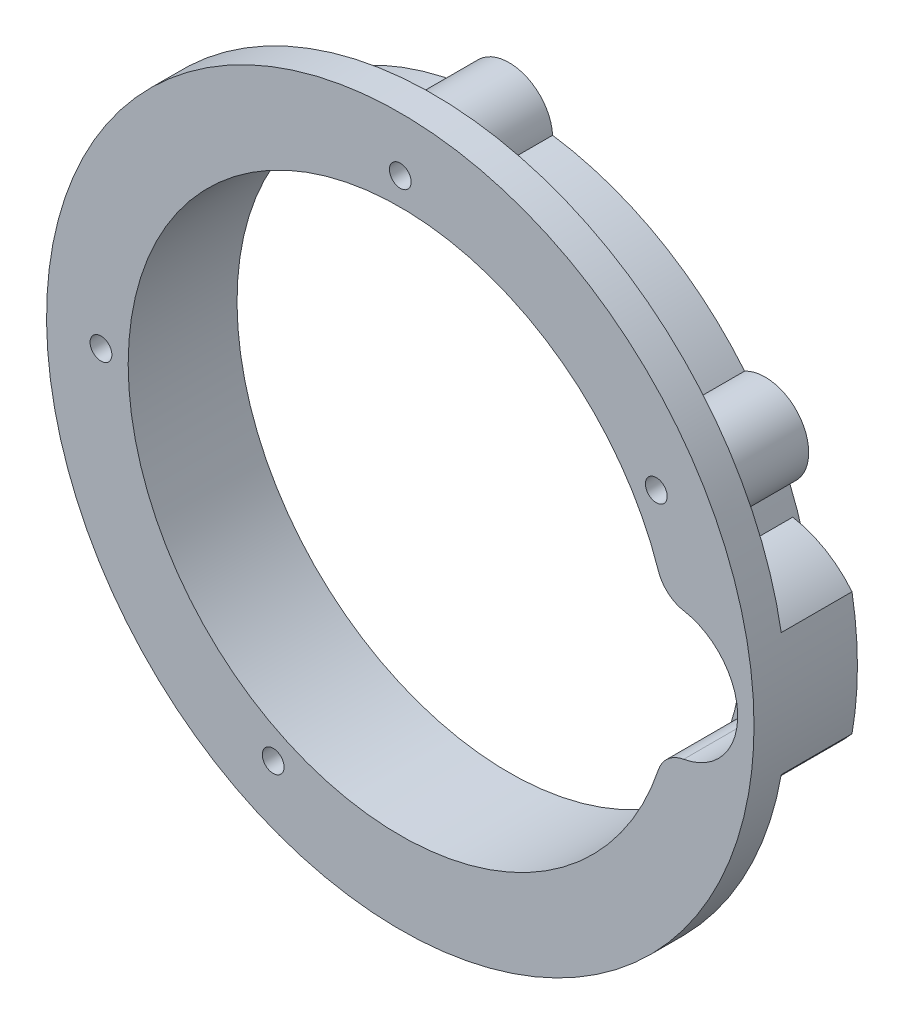
ISO-10303-21;
HEADER;
FILE_DESCRIPTION(('STEP AP214'),'2;1');
FILE_NAME('part.step','',(''),(''),'','','');
FILE_SCHEMA(('AUTOMOTIVE_DESIGN { 1 0 10303 214 1 1 1 1 }'));
ENDSEC;
DATA;
#1=APPLICATION_CONTEXT('core data for automotive mechanical design processes');
#2=APPLICATION_PROTOCOL_DEFINITION('international standard','automotive_design',2000,#1);
#3=PRODUCT_CONTEXT('',#1,'mechanical');
#4=PRODUCT('Part','Part','',(#3));
#5=PRODUCT_RELATED_PRODUCT_CATEGORY('part','',(#4));
#6=PRODUCT_DEFINITION_FORMATION('','',#4);
#7=PRODUCT_DEFINITION_CONTEXT('part definition',#1,'design');
#8=PRODUCT_DEFINITION('design','',#6,#7);
#9=PRODUCT_DEFINITION_SHAPE('','',#8);
#10=(LENGTH_UNIT() NAMED_UNIT(*) SI_UNIT(.MILLI.,.METRE.));
#11=(NAMED_UNIT(*) PLANE_ANGLE_UNIT() SI_UNIT($,.RADIAN.));
#12=(NAMED_UNIT(*) SI_UNIT($,.STERADIAN.) SOLID_ANGLE_UNIT());
#13=UNCERTAINTY_MEASURE_WITH_UNIT(LENGTH_MEASURE(1.E-05),#10,'distance_accuracy_value','');
#14=(GEOMETRIC_REPRESENTATION_CONTEXT(3) GLOBAL_UNCERTAINTY_ASSIGNED_CONTEXT((#13)) GLOBAL_UNIT_ASSIGNED_CONTEXT((#10,
#11,#12)) REPRESENTATION_CONTEXT('',''));
#15=CARTESIAN_POINT('',(0.,0.,0.));
#16=DIRECTION('',(0.,0.,1.));
#17=DIRECTION('',(1.,0.,0.));
#18=AXIS2_PLACEMENT_3D('',#15,#16,#17);
#19=CARTESIAN_POINT('',(0.,0.,0.));
#20=DIRECTION('',(0.,0.,1.));
#21=DIRECTION('',(1.,0.,0.));
#22=AXIS2_PLACEMENT_3D('',#19,#20,#21);
#23=PLANE('',#22);
#24=CARTESIAN_POINT('',(-11.6772727272727,-24.8976163849653,0.));
#25=DIRECTION('',(0.,0.,1.));
#26=DIRECTION('',(1.,0.,0.));
#27=AXIS2_PLACEMENT_3D('',#24,#25,#26);
#28=CIRCLE('',#27,1.);
#29=CARTESIAN_POINT('',(-10.6772727272727,-24.8976163849653,0.));
#30=VERTEX_POINT('',#29);
#31=EDGE_CURVE('E232',#30,#30,#28,.T.);
#32=ORIENTED_EDGE('',*,*,#31,.T.);
#33=EDGE_LOOP('',(#32));
#34=FACE_BOUND('',#33,.T.);
#35=CARTESIAN_POINT('',(-27.5,0.,0.));
#36=DIRECTION('',(0.,0.,1.));
#37=DIRECTION('',(1.,0.,0.));
#38=AXIS2_PLACEMENT_3D('',#35,#36,#37);
#39=CIRCLE('',#38,1.);
#40=CARTESIAN_POINT('',(-26.5,0.,0.));
#41=VERTEX_POINT('',#40);
#42=EDGE_CURVE('E238',#41,#41,#39,.T.);
#43=ORIENTED_EDGE('',*,*,#42,.T.);
#44=EDGE_LOOP('',(#43));
#45=FACE_BOUND('',#44,.T.);
#46=CARTESIAN_POINT('',(23.5226916995778,14.2454545454545,0.));
#47=DIRECTION('',(0.,0.,1.));
#48=DIRECTION('',(1.,0.,0.));
#49=AXIS2_PLACEMENT_3D('',#46,#47,#48);
#50=CIRCLE('',#49,1.);
#51=CARTESIAN_POINT('',(24.5226916995778,14.2454545454545,0.));
#52=VERTEX_POINT('',#51);
#53=EDGE_CURVE('E244',#52,#52,#50,.T.);
#54=ORIENTED_EDGE('',*,*,#53,.T.);
#55=EDGE_LOOP('',(#54));
#56=FACE_BOUND('',#55,.T.);
#57=CARTESIAN_POINT('',(0.,27.5,0.));
#58=DIRECTION('',(0.,0.,1.));
#59=DIRECTION('',(1.,0.,0.));
#60=AXIS2_PLACEMENT_3D('',#57,#58,#59);
#61=CIRCLE('',#60,1.);
#62=CARTESIAN_POINT('',(1.,27.5,0.));
#63=VERTEX_POINT('',#62);
#64=EDGE_CURVE('E250',#63,#63,#61,.T.);
#65=ORIENTED_EDGE('',*,*,#64,.T.);
#66=EDGE_LOOP('',(#65));
#67=FACE_BOUND('',#66,.T.);
#68=CARTESIAN_POINT('',(0.,0.,0.));
#69=DIRECTION('',(0.,0.,1.));
#70=DIRECTION('',(1.,0.,0.));
#71=AXIS2_PLACEMENT_3D('',#68,#69,#70);
#72=CIRCLE('',#71,25.);
#73=CARTESIAN_POINT('',(25.,0.,0.));
#74=VERTEX_POINT('',#73);
#75=EDGE_CURVE('E256',#74,#74,#72,.T.);
#76=ORIENTED_EDGE('',*,*,#75,.T.);
#77=EDGE_LOOP('',(#76));
#78=FACE_BOUND('',#77,.T.);
#79=CARTESIAN_POINT('',(0.,0.,0.));
#80=DIRECTION('',(0.,0.,1.));
#81=DIRECTION('',(1.,0.,0.));
#82=AXIS2_PLACEMENT_3D('',#79,#80,#81);
#83=CIRCLE('',#82,28.);
#84=CARTESIAN_POINT('',(-27.7136363636364,-3.99429086373692,0.));
#85=VERTEX_POINT('',#84);
#86=CARTESIAN_POINT('',(-15.384291335925,-23.3949477471394,0.));
#87=VERTEX_POINT('',#86);
#88=EDGE_CURVE('E189',#85,#87,#83,.T.);
#89=ORIENTED_EDGE('',*,*,#88,.F.);
#90=CARTESIAN_POINT('',(-27.5,0.,0.));
#91=DIRECTION('',(0.,0.,1.));
#92=DIRECTION('',(1.,0.,0.));
#93=AXIS2_PLACEMENT_3D('',#90,#91,#92);
#94=CIRCLE('',#93,4.);
#95=CARTESIAN_POINT('',(-27.7136363636364,3.99429086373692,0.));
#96=VERTEX_POINT('',#95);
#97=EDGE_CURVE('E200',#96,#85,#94,.T.);
#98=ORIENTED_EDGE('',*,*,#97,.F.);
#99=CARTESIAN_POINT('',(-3.99429086373693,27.7136363636364,0.));
#100=VERTEX_POINT('',#99);
#101=EDGE_CURVE('E51',#100,#96,#83,.T.);
#102=ORIENTED_EDGE('',*,*,#101,.F.);
#103=CARTESIAN_POINT('',(0.,27.5,0.));
#104=DIRECTION('',(0.,0.,1.));
#105=DIRECTION('',(1.,0.,0.));
#106=AXIS2_PLACEMENT_3D('',#103,#104,#105);
#107=CIRCLE('',#106,4.);
#108=CARTESIAN_POINT('',(3.99429086373693,27.7136363636364,0.));
#109=VERTEX_POINT('',#108);
#110=EDGE_CURVE('E191',#109,#100,#107,.T.);
#111=ORIENTED_EDGE('',*,*,#110,.F.);
#112=CARTESIAN_POINT('',(21.6363212769214,17.772720714675,0.));
#113=VERTEX_POINT('',#112);
#114=EDGE_CURVE('E190',#113,#109,#83,.T.);
#115=ORIENTED_EDGE('',*,*,#114,.F.);
#116=CARTESIAN_POINT('',(23.5226916995778,14.2454545454545,0.));
#117=DIRECTION('',(0.,0.,1.));
#118=DIRECTION('',(1.,0.,0.));
#119=AXIS2_PLACEMENT_3D('',#116,#117,#118);
#120=CIRCLE('',#119,4.);
#121=CARTESIAN_POINT('',(25.7745386544261,10.9395227113205,0.));
#122=VERTEX_POINT('',#121);
#123=EDGE_CURVE('E196',#122,#113,#120,.T.);
#124=ORIENTED_EDGE('',*,*,#123,.F.);
#125=CARTESIAN_POINT('',(-8.15168612463095,-26.7871240211692,0.));
#126=VERTEX_POINT('',#125);
#127=EDGE_CURVE('E187',#126,#122,#83,.T.);
#128=ORIENTED_EDGE('',*,*,#127,.F.);
#129=CARTESIAN_POINT('',(-11.6772727272727,-24.8976163849653,0.));
#130=DIRECTION('',(0.,0.,1.));
#131=DIRECTION('',(1.,0.,0.));
#132=AXIS2_PLACEMENT_3D('',#129,#130,#131);
#133=CIRCLE('',#132,4.);
#134=EDGE_CURVE('E184',#87,#126,#133,.T.);
#135=ORIENTED_EDGE('',*,*,#134,.F.);
#136=EDGE_LOOP('',(#89,#98,#102,#111,#115,#124,#128,#135));
#137=FACE_BOUND('',#136,.T.);
#138=ADVANCED_FACE('F36',(#34,#45,#56,#67,#78,#137),#23,.F.);
#139=CARTESIAN_POINT('',(0.,0.,10.));
#140=DIRECTION('',(0.,0.,1.));
#141=DIRECTION('',(1.,0.,0.));
#142=AXIS2_PLACEMENT_3D('',#139,#140,#141);
#143=PLANE('',#142);
#144=CARTESIAN_POINT('',(25.,0.,10.));
#145=DIRECTION('',(0.,0.,1.));
#146=DIRECTION('',(1.,0.,0.));
#147=AXIS2_PLACEMENT_3D('',#144,#145,#146);
#148=CIRCLE('',#147,6.);
#149=CARTESIAN_POINT('',(26.04,-5.90917930003821,10.));
#150=VERTEX_POINT('',#149);
#151=CARTESIAN_POINT('',(26.04,5.90917930003821,10.));
#152=VERTEX_POINT('',#151);
#153=EDGE_CURVE('E228',#150,#152,#148,.T.);
#154=ORIENTED_EDGE('',*,*,#153,.F.);
#155=CARTESIAN_POINT('',(26.56,-8.86376895005731,10.));
#156=DIRECTION('',(0.,0.,1.));
#157=DIRECTION('',(1.,0.,0.));
#158=AXIS2_PLACEMENT_3D('',#155,#156,#157);
#159=CIRCLE('',#158,3.);
#160=CARTESIAN_POINT('',(23.7142857142857,-7.91407941969402,10.));
#161=VERTEX_POINT('',#160);
#162=EDGE_CURVE('E277',#150,#161,#159,.T.);
#163=ORIENTED_EDGE('',*,*,#162,.T.);
#164=CARTESIAN_POINT('',(0.,0.,10.));
#165=DIRECTION('',(0.,0.,1.));
#166=DIRECTION('',(1.,0.,0.));
#167=AXIS2_PLACEMENT_3D('',#164,#165,#166);
#168=CIRCLE('',#167,25.);
#169=CARTESIAN_POINT('',(23.7142857142857,7.91407941969402,10.));
#170=VERTEX_POINT('',#169);
#171=EDGE_CURVE('E259',#170,#161,#168,.T.);
#172=ORIENTED_EDGE('',*,*,#171,.F.);
#173=CARTESIAN_POINT('',(26.56,8.86376895005731,10.));
#174=DIRECTION('',(0.,0.,1.));
#175=DIRECTION('',(1.,0.,0.));
#176=AXIS2_PLACEMENT_3D('',#173,#174,#175);
#177=CIRCLE('',#176,3.);
#178=EDGE_CURVE('E275',#170,#152,#177,.T.);
#179=ORIENTED_EDGE('',*,*,#178,.T.);
#180=EDGE_LOOP('',(#154,#163,#172,#179));
#181=FACE_BOUND('',#180,.T.);
#182=CARTESIAN_POINT('',(-27.5,0.,10.));
#183=DIRECTION('',(0.,0.,1.));
#184=DIRECTION('',(1.,0.,0.));
#185=AXIS2_PLACEMENT_3D('',#182,#183,#184);
#186=CIRCLE('',#185,1.);
#187=CARTESIAN_POINT('',(-26.5,0.,10.));
#188=VERTEX_POINT('',#187);
#189=EDGE_CURVE('E241',#188,#188,#186,.T.);
#190=ORIENTED_EDGE('',*,*,#189,.F.);
#191=EDGE_LOOP('',(#190));
#192=FACE_BOUND('',#191,.T.);
#193=CARTESIAN_POINT('',(0.,27.5,10.));
#194=DIRECTION('',(0.,0.,1.));
#195=DIRECTION('',(1.,0.,0.));
#196=AXIS2_PLACEMENT_3D('',#193,#194,#195);
#197=CIRCLE('',#196,1.);
#198=CARTESIAN_POINT('',(1.,27.5,10.));
#199=VERTEX_POINT('',#198);
#200=EDGE_CURVE('E253',#199,#199,#197,.T.);
#201=ORIENTED_EDGE('',*,*,#200,.F.);
#202=EDGE_LOOP('',(#201));
#203=FACE_BOUND('',#202,.T.);
#204=CARTESIAN_POINT('',(0.,0.,10.));
#205=DIRECTION('',(0.,0.,1.));
#206=DIRECTION('',(1.,0.,0.));
#207=AXIS2_PLACEMENT_3D('',#204,#205,#206);
#208=CIRCLE('',#207,32.5);
#209=CARTESIAN_POINT('',(32.5,0.,10.));
#210=VERTEX_POINT('',#209);
#211=EDGE_CURVE('E262',#210,#210,#208,.T.);
#212=ORIENTED_EDGE('',*,*,#211,.T.);
#213=EDGE_LOOP('',(#212));
#214=FACE_BOUND('',#213,.T.);
#215=CARTESIAN_POINT('',(23.5226916995778,14.2454545454545,10.));
#216=DIRECTION('',(0.,0.,1.));
#217=DIRECTION('',(1.,0.,0.));
#218=AXIS2_PLACEMENT_3D('',#215,#216,#217);
#219=CIRCLE('',#218,1.);
#220=CARTESIAN_POINT('',(24.5226916995778,14.2454545454545,10.));
#221=VERTEX_POINT('',#220);
#222=EDGE_CURVE('E247',#221,#221,#219,.T.);
#223=ORIENTED_EDGE('',*,*,#222,.F.);
#224=EDGE_LOOP('',(#223));
#225=FACE_BOUND('',#224,.T.);
#226=CARTESIAN_POINT('',(-11.6772727272727,-24.8976163849653,10.));
#227=DIRECTION('',(0.,0.,1.));
#228=DIRECTION('',(1.,0.,0.));
#229=AXIS2_PLACEMENT_3D('',#226,#227,#228);
#230=CIRCLE('',#229,1.);
#231=CARTESIAN_POINT('',(-10.6772727272727,-24.8976163849653,10.));
#232=VERTEX_POINT('',#231);
#233=EDGE_CURVE('E235',#232,#232,#230,.T.);
#234=ORIENTED_EDGE('',*,*,#233,.F.);
#235=EDGE_LOOP('',(#234));
#236=FACE_BOUND('',#235,.T.);
#237=ADVANCED_FACE('F297',(#181,#192,#203,#214,#225,#236),#143,.T.);
#238=CARTESIAN_POINT('',(0.,0.,10.));
#239=DIRECTION('',(0.,0.,-1.));
#240=DIRECTION('',(-1.,0.,0.));
#241=AXIS2_PLACEMENT_3D('',#238,#239,#240);
#242=CYLINDRICAL_SURFACE('',#241,32.5);
#243=DIRECTION('',(0.,0.,1.));
#244=VECTOR('',#243,1.);
#245=CARTESIAN_POINT('',(32.005,-5.6506614657047,10.));
#246=LINE('',#245,#244);
#247=CARTESIAN_POINT('',(32.005,-5.65066146570468,7.));
#248=VERTEX_POINT('',#247);
#249=CARTESIAN_POINT('',(32.005,-5.6506614657047,0.5));
#250=VERTEX_POINT('',#249);
#251=EDGE_CURVE('E222',#248,#250,#246,.F.);
#252=ORIENTED_EDGE('',*,*,#251,.T.);
#253=CARTESIAN_POINT('',(0.,0.,0.5));
#254=DIRECTION('',(0.,0.,1.));
#255=DIRECTION('',(1.,0.,0.));
#256=AXIS2_PLACEMENT_3D('',#253,#254,#255);
#257=CIRCLE('',#256,32.5);
#258=CARTESIAN_POINT('',(32.005,5.65066146570468,0.5));
#259=VERTEX_POINT('',#258);
#260=EDGE_CURVE('E225',#250,#259,#257,.T.);
#261=ORIENTED_EDGE('',*,*,#260,.T.);
#262=DIRECTION('',(0.,0.,1.));
#263=VECTOR('',#262,1.);
#264=CARTESIAN_POINT('',(32.005,5.65066146570468,3.5));
#265=LINE('',#264,#263);
#266=CARTESIAN_POINT('',(32.005,5.65066146570468,7.));
#267=VERTEX_POINT('',#266);
#268=EDGE_CURVE('E220',#267,#259,#265,.F.);
#269=ORIENTED_EDGE('',*,*,#268,.F.);
#270=CARTESIAN_POINT('',(0.,0.,7.));
#271=DIRECTION('',(0.,0.,1.));
#272=DIRECTION('',(1.,0.,0.));
#273=AXIS2_PLACEMENT_3D('',#270,#271,#272);
#274=CIRCLE('',#273,32.5);
#275=EDGE_CURVE('E165',#267,#248,#274,.T.);
#276=ORIENTED_EDGE('',*,*,#275,.T.);
#277=EDGE_LOOP('',(#252,#261,#269,#276));
#278=FACE_BOUND('',#277,.T.);
#279=ORIENTED_EDGE('',*,*,#211,.F.);
#280=EDGE_LOOP('',(#279));
#281=FACE_BOUND('',#280,.T.);
#282=ADVANCED_FACE('F320',(#278,#281),#242,.T.);
#283=CARTESIAN_POINT('',(0.,0.,10.));
#284=DIRECTION('',(0.,0.,-1.));
#285=DIRECTION('',(-1.,0.,0.));
#286=AXIS2_PLACEMENT_3D('',#283,#284,#285);
#287=CYLINDRICAL_SURFACE('',#286,25.);
#288=ORIENTED_EDGE('',*,*,#171,.T.);
#289=DIRECTION('',(0.,0.,-1.));
#290=VECTOR('',#289,1.);
#291=CARTESIAN_POINT('',(23.7142857142857,-7.91407941969403,10.));
#292=LINE('',#291,#290);
#293=CARTESIAN_POINT('',(23.7142857142857,-7.91407941969402,3.5));
#294=VERTEX_POINT('',#293);
#295=EDGE_CURVE('E281',#161,#294,#292,.T.);
#296=ORIENTED_EDGE('',*,*,#295,.T.);
#297=CARTESIAN_POINT('',(0.,0.,3.5));
#298=DIRECTION('',(0.,0.,1.));
#299=DIRECTION('',(1.,0.,0.));
#300=AXIS2_PLACEMENT_3D('',#297,#298,#299);
#301=CIRCLE('',#300,25.);
#302=CARTESIAN_POINT('',(23.7142857142857,7.91407941969402,3.5));
#303=VERTEX_POINT('',#302);
#304=EDGE_CURVE('E267',#294,#303,#301,.T.);
#305=ORIENTED_EDGE('',*,*,#304,.T.);
#306=DIRECTION('',(0.,0.,-1.));
#307=VECTOR('',#306,1.);
#308=CARTESIAN_POINT('',(23.7142857142857,7.91407941969403,10.));
#309=LINE('',#308,#307);
#310=EDGE_CURVE('E279',#303,#170,#309,.F.);
#311=ORIENTED_EDGE('',*,*,#310,.T.);
#312=EDGE_LOOP('',(#288,#296,#305,#311));
#313=FACE_BOUND('',#312,.T.);
#314=ORIENTED_EDGE('',*,*,#75,.F.);
#315=EDGE_LOOP('',(#314));
#316=FACE_BOUND('',#315,.T.);
#317=ADVANCED_FACE('F301',(#313,#316),#287,.F.);
#318=CARTESIAN_POINT('',(0.,27.5,10.));
#319=DIRECTION('',(0.,0.,-1.));
#320=DIRECTION('',(-1.,0.,0.));
#321=AXIS2_PLACEMENT_3D('',#318,#319,#320);
#322=CYLINDRICAL_SURFACE('',#321,1.);
#323=ORIENTED_EDGE('',*,*,#200,.T.);
#324=EDGE_LOOP('',(#323));
#325=FACE_BOUND('',#324,.T.);
#326=ORIENTED_EDGE('',*,*,#64,.F.);
#327=EDGE_LOOP('',(#326));
#328=FACE_BOUND('',#327,.T.);
#329=ADVANCED_FACE('F330',(#325,#328),#322,.F.);
#330=CARTESIAN_POINT('',(23.5226916995778,14.2454545454545,10.));
#331=DIRECTION('',(0.,0.,-1.));
#332=DIRECTION('',(-1.,0.,0.));
#333=AXIS2_PLACEMENT_3D('',#330,#331,#332);
#334=CYLINDRICAL_SURFACE('',#333,1.);
#335=ORIENTED_EDGE('',*,*,#222,.T.);
#336=EDGE_LOOP('',(#335));
#337=FACE_BOUND('',#336,.T.);
#338=ORIENTED_EDGE('',*,*,#53,.F.);
#339=EDGE_LOOP('',(#338));
#340=FACE_BOUND('',#339,.T.);
#341=ADVANCED_FACE('F350',(#337,#340),#334,.F.);
#342=CARTESIAN_POINT('',(-27.5,0.,10.));
#343=DIRECTION('',(0.,0.,-1.));
#344=DIRECTION('',(-1.,0.,0.));
#345=AXIS2_PLACEMENT_3D('',#342,#343,#344);
#346=CYLINDRICAL_SURFACE('',#345,1.);
#347=ORIENTED_EDGE('',*,*,#189,.T.);
#348=EDGE_LOOP('',(#347));
#349=FACE_BOUND('',#348,.T.);
#350=ORIENTED_EDGE('',*,*,#42,.F.);
#351=EDGE_LOOP('',(#350));
#352=FACE_BOUND('',#351,.T.);
#353=ADVANCED_FACE('F342',(#349,#352),#346,.F.);
#354=CARTESIAN_POINT('',(-11.6772727272727,-24.8976163849653,10.));
#355=DIRECTION('',(0.,0.,-1.));
#356=DIRECTION('',(-1.,0.,0.));
#357=AXIS2_PLACEMENT_3D('',#354,#355,#356);
#358=CYLINDRICAL_SURFACE('',#357,1.);
#359=ORIENTED_EDGE('',*,*,#233,.T.);
#360=EDGE_LOOP('',(#359));
#361=FACE_BOUND('',#360,.T.);
#362=ORIENTED_EDGE('',*,*,#31,.F.);
#363=EDGE_LOOP('',(#362));
#364=FACE_BOUND('',#363,.T.);
#365=ADVANCED_FACE('F339',(#361,#364),#358,.F.);
#366=CARTESIAN_POINT('',(25.,0.,3.5));
#367=DIRECTION('',(0.,0.,1.));
#368=DIRECTION('',(1.,0.,0.));
#369=AXIS2_PLACEMENT_3D('',#366,#367,#368);
#370=CYLINDRICAL_SURFACE('',#369,6.);
#371=CARTESIAN_POINT('',(25.,0.,3.5));
#372=DIRECTION('',(0.,0.,1.));
#373=DIRECTION('',(1.,0.,0.));
#374=AXIS2_PLACEMENT_3D('',#371,#372,#373);
#375=CIRCLE('',#374,6.);
#376=CARTESIAN_POINT('',(26.04,-5.90917930003821,3.5));
#377=VERTEX_POINT('',#376);
#378=CARTESIAN_POINT('',(26.04,5.90917930003821,3.5));
#379=VERTEX_POINT('',#378);
#380=EDGE_CURVE('E229',#377,#379,#375,.T.);
#381=ORIENTED_EDGE('',*,*,#380,.F.);
#382=DIRECTION('',(0.,0.,1.));
#383=VECTOR('',#382,1.);
#384=CARTESIAN_POINT('',(26.04,-5.90917930003821,3.5));
#385=LINE('',#384,#383);
#386=EDGE_CURVE('E272',#377,#150,#385,.T.);
#387=ORIENTED_EDGE('',*,*,#386,.T.);
#388=ORIENTED_EDGE('',*,*,#153,.T.);
#389=DIRECTION('',(0.,0.,1.));
#390=VECTOR('',#389,1.);
#391=CARTESIAN_POINT('',(26.04,5.90917930003821,3.5));
#392=LINE('',#391,#390);
#393=EDGE_CURVE('E269',#152,#379,#392,.F.);
#394=ORIENTED_EDGE('',*,*,#393,.T.);
#395=EDGE_LOOP('',(#381,#387,#388,#394));
#396=FACE_BOUND('',#395,.T.);
#397=ADVANCED_FACE('F291',(#396),#370,.F.);
#398=CARTESIAN_POINT('',(25.,0.,3.5));
#399=DIRECTION('',(0.,0.,1.));
#400=DIRECTION('',(1.,0.,0.));
#401=AXIS2_PLACEMENT_3D('',#398,#399,#400);
#402=PLANE('',#401);
#403=ORIENTED_EDGE('',*,*,#304,.F.);
#404=CARTESIAN_POINT('',(26.56,-8.86376895005731,3.5));
#405=DIRECTION('',(0.,0.,1.));
#406=DIRECTION('',(1.,0.,0.));
#407=AXIS2_PLACEMENT_3D('',#404,#405,#406);
#408=CIRCLE('',#407,3.);
#409=EDGE_CURVE('E44',#294,#377,#408,.F.);
#410=ORIENTED_EDGE('',*,*,#409,.T.);
#411=ORIENTED_EDGE('',*,*,#380,.T.);
#412=CARTESIAN_POINT('',(26.56,8.86376895005731,3.5));
#413=DIRECTION('',(0.,0.,1.));
#414=DIRECTION('',(1.,0.,0.));
#415=AXIS2_PLACEMENT_3D('',#412,#413,#414);
#416=CIRCLE('',#415,3.);
#417=EDGE_CURVE('E11',#379,#303,#416,.F.);
#418=ORIENTED_EDGE('',*,*,#417,.T.);
#419=EDGE_LOOP('',(#403,#410,#411,#418));
#420=FACE_BOUND('',#419,.T.);
#421=ADVANCED_FACE('F286',(#420),#402,.T.);
#422=CARTESIAN_POINT('',(26.56,-8.86376895005731,10.));
#423=DIRECTION('',(0.,0.,1.));
#424=DIRECTION('',(1.,0.,0.));
#425=AXIS2_PLACEMENT_3D('',#422,#423,#424);
#426=CYLINDRICAL_SURFACE('',#425,3.);
#427=ORIENTED_EDGE('',*,*,#409,.F.);
#428=ORIENTED_EDGE('',*,*,#295,.F.);
#429=ORIENTED_EDGE('',*,*,#162,.F.);
#430=ORIENTED_EDGE('',*,*,#386,.F.);
#431=EDGE_LOOP('',(#427,#428,#429,#430));
#432=FACE_BOUND('',#431,.T.);
#433=ADVANCED_FACE('F294',(#432),#426,.T.);
#434=CARTESIAN_POINT('',(26.56,8.86376895005731,10.));
#435=DIRECTION('',(0.,0.,-1.));
#436=DIRECTION('',(-1.,0.,0.));
#437=AXIS2_PLACEMENT_3D('',#434,#435,#436);
#438=CYLINDRICAL_SURFACE('',#437,3.);
#439=ORIENTED_EDGE('',*,*,#178,.F.);
#440=ORIENTED_EDGE('',*,*,#310,.F.);
#441=ORIENTED_EDGE('',*,*,#417,.F.);
#442=ORIENTED_EDGE('',*,*,#393,.F.);
#443=EDGE_LOOP('',(#439,#440,#441,#442));
#444=FACE_BOUND('',#443,.T.);
#445=ADVANCED_FACE('F38',(#444),#438,.T.);
#446=CARTESIAN_POINT('',(25.,0.,3.5));
#447=DIRECTION('',(0.,0.,1.));
#448=DIRECTION('',(1.,0.,0.));
#449=AXIS2_PLACEMENT_3D('',#446,#447,#448);
#450=CYLINDRICAL_SURFACE('',#449,9.);
#451=CARTESIAN_POINT('',(25.,0.,7.));
#452=DIRECTION('',(0.,0.,1.));
#453=DIRECTION('',(1.,0.,0.));
#454=AXIS2_PLACEMENT_3D('',#451,#452,#453);
#455=CIRCLE('',#454,9.);
#456=CARTESIAN_POINT('',(26.56,-8.86376895005731,7.));
#457=VERTEX_POINT('',#456);
#458=EDGE_CURVE('E168',#457,#248,#455,.T.);
#459=ORIENTED_EDGE('',*,*,#458,.F.);
#460=DIRECTION('',(0.,0.,-1.));
#461=VECTOR('',#460,1.);
#462=CARTESIAN_POINT('',(26.56,-8.86376895005731,7.));
#463=LINE('',#462,#461);
#464=CARTESIAN_POINT('',(26.56,-8.86376895005731,0.5));
#465=VERTEX_POINT('',#464);
#466=EDGE_CURVE('E173',#457,#465,#463,.T.);
#467=ORIENTED_EDGE('',*,*,#466,.T.);
#468=CARTESIAN_POINT('',(25.,0.,0.5));
#469=DIRECTION('',(0.,0.,1.));
#470=DIRECTION('',(1.,0.,0.));
#471=AXIS2_PLACEMENT_3D('',#468,#469,#470);
#472=CIRCLE('',#471,9.);
#473=EDGE_CURVE('E181',#465,#250,#472,.T.);
#474=ORIENTED_EDGE('',*,*,#473,.T.);
#475=ORIENTED_EDGE('',*,*,#251,.F.);
#476=EDGE_LOOP('',(#459,#467,#474,#475));
#477=FACE_BOUND('',#476,.T.);
#478=ADVANCED_FACE('F306',(#477),#450,.T.);
#479=CARTESIAN_POINT('',(0.,0.,10.));
#480=DIRECTION('',(0.,0.,-1.));
#481=DIRECTION('',(-1.,0.,0.));
#482=AXIS2_PLACEMENT_3D('',#479,#480,#481);
#483=CYLINDRICAL_SURFACE('',#482,28.);
#484=DIRECTION('',(0.,0.,1.));
#485=VECTOR('',#484,1.);
#486=CARTESIAN_POINT('',(3.99429086373692,27.7136363636364,10.));
#487=LINE('',#486,#485);
#488=CARTESIAN_POINT('',(3.99429086373692,27.7136363636364,7.));
#489=VERTEX_POINT('',#488);
#490=EDGE_CURVE('E218',#109,#489,#487,.T.);
#491=ORIENTED_EDGE('',*,*,#490,.T.);
#492=CARTESIAN_POINT('',(0.,0.,7.));
#493=DIRECTION('',(0.,0.,1.));
#494=DIRECTION('',(1.,0.,0.));
#495=AXIS2_PLACEMENT_3D('',#492,#493,#494);
#496=CIRCLE('',#495,28.);
#497=CARTESIAN_POINT('',(21.6363212769214,17.772720714675,7.));
#498=VERTEX_POINT('',#497);
#499=EDGE_CURVE('E159',#498,#489,#496,.T.);
#500=ORIENTED_EDGE('',*,*,#499,.F.);
#501=DIRECTION('',(0.,0.,1.));
#502=VECTOR('',#501,1.);
#503=CARTESIAN_POINT('',(21.6363212769214,17.772720714675,10.));
#504=LINE('',#503,#502);
#505=EDGE_CURVE('E214',#113,#498,#504,.T.);
#506=ORIENTED_EDGE('',*,*,#505,.F.);
#507=ORIENTED_EDGE('',*,*,#114,.T.);
#508=EDGE_LOOP('',(#491,#500,#506,#507));
#509=FACE_BOUND('',#508,.T.);
#510=ADVANCED_FACE('F311',(#509),#483,.T.);
#511=ORIENTED_EDGE('',*,*,#101,.T.);
#512=DIRECTION('',(0.,0.,1.));
#513=VECTOR('',#512,1.);
#514=CARTESIAN_POINT('',(-27.7136363636364,3.99429086373692,10.));
#515=LINE('',#514,#513);
#516=CARTESIAN_POINT('',(-27.7136363636364,3.99429086373693,7.));
#517=VERTEX_POINT('',#516);
#518=EDGE_CURVE('E209',#96,#517,#515,.T.);
#519=ORIENTED_EDGE('',*,*,#518,.T.);
#520=CARTESIAN_POINT('',(-3.99429086373692,27.7136363636364,7.));
#521=VERTEX_POINT('',#520);
#522=EDGE_CURVE('E397',#521,#517,#496,.T.);
#523=ORIENTED_EDGE('',*,*,#522,.F.);
#524=DIRECTION('',(0.,0.,1.));
#525=VECTOR('',#524,1.);
#526=CARTESIAN_POINT('',(-3.99429086373693,27.7136363636364,10.));
#527=LINE('',#526,#525);
#528=EDGE_CURVE('E216',#100,#521,#527,.T.);
#529=ORIENTED_EDGE('',*,*,#528,.F.);
#530=EDGE_LOOP('',(#511,#519,#523,#529));
#531=FACE_BOUND('',#530,.T.);
#532=ADVANCED_FACE('F401',(#531),#483,.T.);
#533=ORIENTED_EDGE('',*,*,#88,.T.);
#534=DIRECTION('',(0.,0.,1.));
#535=VECTOR('',#534,1.);
#536=CARTESIAN_POINT('',(-15.384291335925,-23.3949477471394,10.));
#537=LINE('',#536,#535);
#538=CARTESIAN_POINT('',(-15.384291335925,-23.3949477471394,7.));
#539=VERTEX_POINT('',#538);
#540=EDGE_CURVE('E177',#87,#539,#537,.T.);
#541=ORIENTED_EDGE('',*,*,#540,.T.);
#542=CARTESIAN_POINT('',(-27.7136363636364,-3.99429086373693,7.));
#543=VERTEX_POINT('',#542);
#544=EDGE_CURVE('E161',#543,#539,#496,.T.);
#545=ORIENTED_EDGE('',*,*,#544,.F.);
#546=DIRECTION('',(0.,0.,1.));
#547=VECTOR('',#546,1.);
#548=CARTESIAN_POINT('',(-27.7136363636364,-3.99429086373693,10.));
#549=LINE('',#548,#547);
#550=EDGE_CURVE('E211',#85,#543,#549,.T.);
#551=ORIENTED_EDGE('',*,*,#550,.F.);
#552=EDGE_LOOP('',(#533,#541,#545,#551));
#553=FACE_BOUND('',#552,.T.);
#554=ADVANCED_FACE('F405',(#553),#483,.T.);
#555=CARTESIAN_POINT('',(0.,0.,7.));
#556=DIRECTION('',(0.,0.,1.));
#557=DIRECTION('',(1.,0.,0.));
#558=AXIS2_PLACEMENT_3D('',#555,#556,#557);
#559=PLANE('',#558);
#560=CARTESIAN_POINT('',(26.56,8.86376895005731,7.));
#561=VERTEX_POINT('',#560);
#562=EDGE_CURVE('E59',#267,#561,#455,.T.);
#563=ORIENTED_EDGE('',*,*,#562,.T.);
#564=CARTESIAN_POINT('',(25.7745386544261,10.9395227113205,7.));
#565=VERTEX_POINT('',#564);
#566=EDGE_CURVE('E150',#561,#565,#496,.T.);
#567=ORIENTED_EDGE('',*,*,#566,.T.);
#568=CARTESIAN_POINT('',(23.5226916995778,14.2454545454545,7.));
#569=DIRECTION('',(0.,0.,1.));
#570=DIRECTION('',(1.,0.,0.));
#571=AXIS2_PLACEMENT_3D('',#568,#569,#570);
#572=CIRCLE('',#571,4.);
#573=EDGE_CURVE('E195',#565,#498,#572,.T.);
#574=ORIENTED_EDGE('',*,*,#573,.T.);
#575=ORIENTED_EDGE('',*,*,#499,.T.);
#576=CARTESIAN_POINT('',(0.,27.5,7.));
#577=DIRECTION('',(0.,0.,1.));
#578=DIRECTION('',(1.,0.,0.));
#579=AXIS2_PLACEMENT_3D('',#576,#577,#578);
#580=CIRCLE('',#579,4.);
#581=EDGE_CURVE('E194',#489,#521,#580,.T.);
#582=ORIENTED_EDGE('',*,*,#581,.T.);
#583=ORIENTED_EDGE('',*,*,#522,.T.);
#584=CARTESIAN_POINT('',(-27.5,0.,7.));
#585=DIRECTION('',(0.,0.,1.));
#586=DIRECTION('',(1.,0.,0.));
#587=AXIS2_PLACEMENT_3D('',#584,#585,#586);
#588=CIRCLE('',#587,4.);
#589=EDGE_CURVE('E199',#517,#543,#588,.T.);
#590=ORIENTED_EDGE('',*,*,#589,.T.);
#591=ORIENTED_EDGE('',*,*,#544,.T.);
#592=CARTESIAN_POINT('',(-11.6772727272727,-24.8976163849653,7.));
#593=DIRECTION('',(0.,0.,1.));
#594=DIRECTION('',(1.,0.,0.));
#595=AXIS2_PLACEMENT_3D('',#592,#593,#594);
#596=CIRCLE('',#595,4.);
#597=CARTESIAN_POINT('',(-8.15168612463095,-26.7871240211692,7.));
#598=VERTEX_POINT('',#597);
#599=EDGE_CURVE('E203',#539,#598,#596,.T.);
#600=ORIENTED_EDGE('',*,*,#599,.T.);
#601=EDGE_CURVE('E186',#598,#457,#496,.T.);
#602=ORIENTED_EDGE('',*,*,#601,.T.);
#603=ORIENTED_EDGE('',*,*,#458,.T.);
#604=ORIENTED_EDGE('',*,*,#275,.F.);
#605=EDGE_LOOP('',(#563,#567,#574,#575,#582,#583,#590,#591,#600,#602,#603,#604));
#606=FACE_BOUND('',#605,.T.);
#607=ADVANCED_FACE('F162',(#606),#559,.F.);
#608=DIRECTION('',(0.,0.,1.));
#609=VECTOR('',#608,1.);
#610=CARTESIAN_POINT('',(25.7745386544261,10.9395227113205,10.));
#611=LINE('',#610,#609);
#612=EDGE_CURVE('E155',#122,#565,#611,.T.);
#613=ORIENTED_EDGE('',*,*,#612,.T.);
#614=ORIENTED_EDGE('',*,*,#566,.F.);
#615=DIRECTION('',(0.,0.,-1.));
#616=VECTOR('',#615,1.);
#617=CARTESIAN_POINT('',(26.56,8.86376895005731,0.5));
#618=LINE('',#617,#616);
#619=CARTESIAN_POINT('',(26.56,8.86376895005731,0.5));
#620=VERTEX_POINT('',#619);
#621=EDGE_CURVE('E153',#620,#561,#618,.F.);
#622=ORIENTED_EDGE('',*,*,#621,.F.);
#623=CARTESIAN_POINT('',(0.,0.,0.5));
#624=DIRECTION('',(0.,0.,1.));
#625=DIRECTION('',(1.,0.,0.));
#626=AXIS2_PLACEMENT_3D('',#623,#624,#625);
#627=CIRCLE('',#626,28.);
#628=EDGE_CURVE('E174',#465,#620,#627,.T.);
#629=ORIENTED_EDGE('',*,*,#628,.F.);
#630=ORIENTED_EDGE('',*,*,#466,.F.);
#631=ORIENTED_EDGE('',*,*,#601,.F.);
#632=DIRECTION('',(0.,0.,1.));
#633=VECTOR('',#632,1.);
#634=CARTESIAN_POINT('',(-8.15168612463095,-26.7871240211692,10.));
#635=LINE('',#634,#633);
#636=EDGE_CURVE('E207',#126,#598,#635,.T.);
#637=ORIENTED_EDGE('',*,*,#636,.F.);
#638=ORIENTED_EDGE('',*,*,#127,.T.);
#639=EDGE_LOOP('',(#613,#614,#622,#629,#630,#631,#637,#638));
#640=FACE_BOUND('',#639,.T.);
#641=ADVANCED_FACE('F151',(#640),#483,.T.);
#642=CARTESIAN_POINT('',(0.,27.5,10.));
#643=DIRECTION('',(0.,0.,-1.));
#644=DIRECTION('',(-1.,0.,0.));
#645=AXIS2_PLACEMENT_3D('',#642,#643,#644);
#646=CYLINDRICAL_SURFACE('',#645,4.);
#647=ORIENTED_EDGE('',*,*,#110,.T.);
#648=ORIENTED_EDGE('',*,*,#528,.T.);
#649=ORIENTED_EDGE('',*,*,#581,.F.);
#650=ORIENTED_EDGE('',*,*,#490,.F.);
#651=EDGE_LOOP('',(#647,#648,#649,#650));
#652=FACE_BOUND('',#651,.T.);
#653=ADVANCED_FACE('F400',(#652),#646,.T.);
#654=CARTESIAN_POINT('',(23.5226916995778,14.2454545454545,10.));
#655=DIRECTION('',(0.,0.,-1.));
#656=DIRECTION('',(-1.,0.,0.));
#657=AXIS2_PLACEMENT_3D('',#654,#655,#656);
#658=CYLINDRICAL_SURFACE('',#657,4.);
#659=ORIENTED_EDGE('',*,*,#505,.T.);
#660=ORIENTED_EDGE('',*,*,#573,.F.);
#661=ORIENTED_EDGE('',*,*,#612,.F.);
#662=ORIENTED_EDGE('',*,*,#123,.T.);
#663=EDGE_LOOP('',(#659,#660,#661,#662));
#664=FACE_BOUND('',#663,.T.);
#665=ADVANCED_FACE('F409',(#664),#658,.T.);
#666=CARTESIAN_POINT('',(-27.5,0.,10.));
#667=DIRECTION('',(0.,0.,-1.));
#668=DIRECTION('',(-1.,0.,0.));
#669=AXIS2_PLACEMENT_3D('',#666,#667,#668);
#670=CYLINDRICAL_SURFACE('',#669,4.);
#671=ORIENTED_EDGE('',*,*,#550,.T.);
#672=ORIENTED_EDGE('',*,*,#589,.F.);
#673=ORIENTED_EDGE('',*,*,#518,.F.);
#674=ORIENTED_EDGE('',*,*,#97,.T.);
#675=EDGE_LOOP('',(#671,#672,#673,#674));
#676=FACE_BOUND('',#675,.T.);
#677=ADVANCED_FACE('F404',(#676),#670,.T.);
#678=CARTESIAN_POINT('',(-11.6772727272727,-24.8976163849653,10.));
#679=DIRECTION('',(0.,0.,-1.));
#680=DIRECTION('',(-1.,0.,0.));
#681=AXIS2_PLACEMENT_3D('',#678,#679,#680);
#682=CYLINDRICAL_SURFACE('',#681,4.);
#683=ORIENTED_EDGE('',*,*,#636,.T.);
#684=ORIENTED_EDGE('',*,*,#599,.F.);
#685=ORIENTED_EDGE('',*,*,#540,.F.);
#686=ORIENTED_EDGE('',*,*,#134,.T.);
#687=EDGE_LOOP('',(#683,#684,#685,#686));
#688=FACE_BOUND('',#687,.T.);
#689=ADVANCED_FACE('F406',(#688),#682,.T.);
#690=ORIENTED_EDGE('',*,*,#268,.T.);
#691=EDGE_CURVE('E167',#259,#620,#472,.T.);
#692=ORIENTED_EDGE('',*,*,#691,.T.);
#693=ORIENTED_EDGE('',*,*,#621,.T.);
#694=ORIENTED_EDGE('',*,*,#562,.F.);
#695=EDGE_LOOP('',(#690,#692,#693,#694));
#696=FACE_BOUND('',#695,.T.);
#697=ADVANCED_FACE('F170',(#696),#450,.T.);
#698=CARTESIAN_POINT('',(25.,0.,0.5));
#699=DIRECTION('',(0.,0.,1.));
#700=DIRECTION('',(1.,0.,0.));
#701=AXIS2_PLACEMENT_3D('',#698,#699,#700);
#702=PLANE('',#701);
#703=ORIENTED_EDGE('',*,*,#473,.F.);
#704=ORIENTED_EDGE('',*,*,#628,.T.);
#705=ORIENTED_EDGE('',*,*,#691,.F.);
#706=ORIENTED_EDGE('',*,*,#260,.F.);
#707=EDGE_LOOP('',(#703,#704,#705,#706));
#708=FACE_BOUND('',#707,.T.);
#709=ADVANCED_FACE('F476',(#708),#702,.F.);
#710=CLOSED_SHELL('',(#138,#237,#282,#317,#329,#341,#353,#365,#397,#421,#433,#445,#478,#510,
#532,#554,#607,#641,#653,#665,#677,#689,#697,#709));
#711=MANIFOLD_SOLID_BREP('B2',#710);
#712=ADVANCED_BREP_SHAPE_REPRESENTATION('',(#18,#711),#14);
#713=SHAPE_DEFINITION_REPRESENTATION(#9,#712);
ENDSEC;
END-ISO-10303-21;
